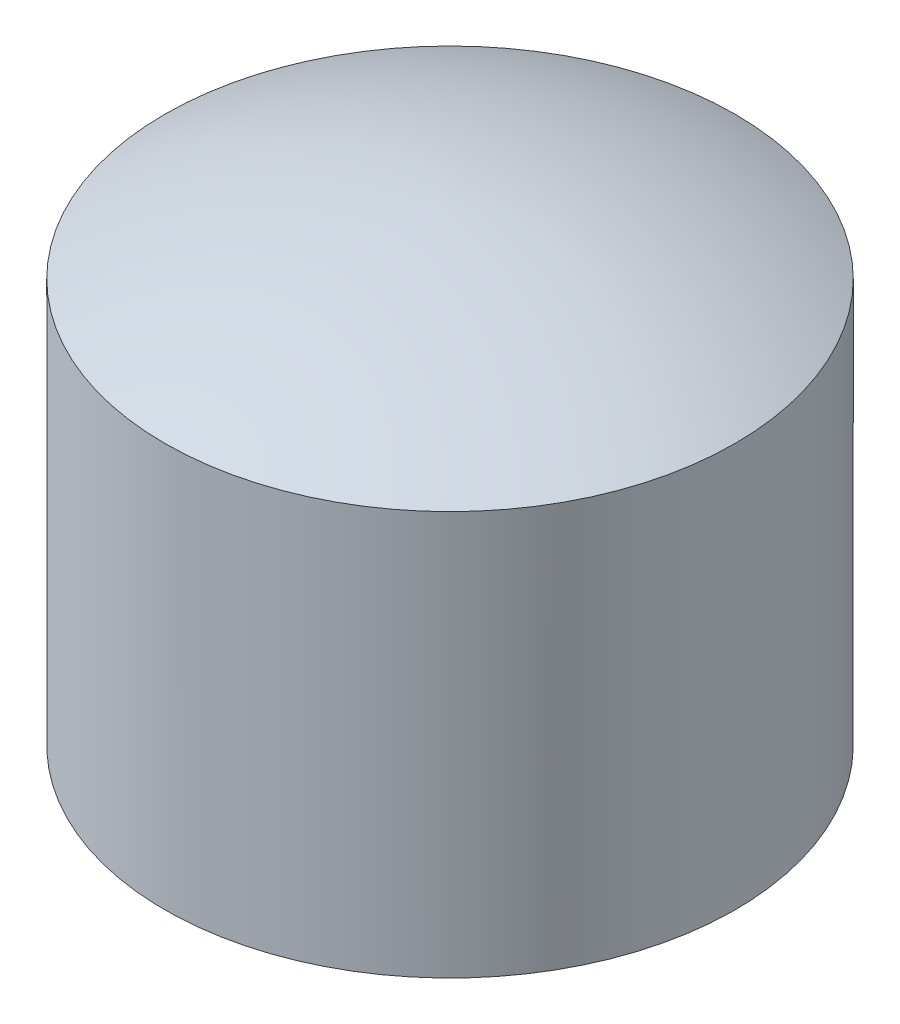
ISO-10303-21;
HEADER;
FILE_DESCRIPTION(('STEP AP214'),'2;1');
FILE_NAME('part.step','',(''),(''),'','','');
FILE_SCHEMA(('AUTOMOTIVE_DESIGN { 1 0 10303 214 1 1 1 1 }'));
ENDSEC;
DATA;
#1=APPLICATION_CONTEXT('core data for automotive mechanical design processes');
#2=APPLICATION_PROTOCOL_DEFINITION('international standard','automotive_design',2000,#1);
#3=PRODUCT_CONTEXT('',#1,'mechanical');
#4=PRODUCT('Part','Part','',(#3));
#5=PRODUCT_RELATED_PRODUCT_CATEGORY('part','',(#4));
#6=PRODUCT_DEFINITION_FORMATION('','',#4);
#7=PRODUCT_DEFINITION_CONTEXT('part definition',#1,'design');
#8=PRODUCT_DEFINITION('design','',#6,#7);
#9=PRODUCT_DEFINITION_SHAPE('','',#8);
#10=(LENGTH_UNIT() NAMED_UNIT(*) SI_UNIT(.MILLI.,.METRE.));
#11=(NAMED_UNIT(*) PLANE_ANGLE_UNIT() SI_UNIT($,.RADIAN.));
#12=(NAMED_UNIT(*) SI_UNIT($,.STERADIAN.) SOLID_ANGLE_UNIT());
#13=UNCERTAINTY_MEASURE_WITH_UNIT(LENGTH_MEASURE(1.E-05),#10,'distance_accuracy_value','');
#14=(GEOMETRIC_REPRESENTATION_CONTEXT(3) GLOBAL_UNCERTAINTY_ASSIGNED_CONTEXT((#13)) GLOBAL_UNIT_ASSIGNED_CONTEXT((#10,
#11,#12)) REPRESENTATION_CONTEXT('',''));
#15=CARTESIAN_POINT('',(0.,0.,0.));
#16=DIRECTION('',(0.,0.,1.));
#17=DIRECTION('',(1.,0.,0.));
#18=AXIS2_PLACEMENT_3D('',#15,#16,#17);
#19=CARTESIAN_POINT('',(0.,4.5,0.));
#20=DIRECTION('',(0.,-1.,0.));
#21=DIRECTION('',(0.,0.,-1.));
#22=AXIS2_PLACEMENT_3D('',#19,#20,#21);
#23=CYLINDRICAL_SURFACE('',#22,6.);
#24=CARTESIAN_POINT('',(0.,4.5,0.));
#25=DIRECTION('',(0.,1.,0.));
#26=DIRECTION('',(0.,0.,1.));
#27=AXIS2_PLACEMENT_3D('',#24,#25,#26);
#28=CIRCLE('',#27,6.);
#29=CARTESIAN_POINT('',(0.,4.5,6.));
#30=VERTEX_POINT('',#29);
#31=EDGE_CURVE('E11',#30,#30,#28,.T.);
#32=ORIENTED_EDGE('',*,*,#31,.F.);
#33=EDGE_LOOP('',(#32));
#34=FACE_BOUND('',#33,.T.);
#35=CARTESIAN_POINT('',(0.,-4.,0.));
#36=DIRECTION('',(0.,-1.,0.));
#37=DIRECTION('',(0.,0.,-1.));
#38=AXIS2_PLACEMENT_3D('',#35,#36,#37);
#39=CIRCLE('',#38,6.);
#40=CARTESIAN_POINT('',(0.,-4.,-6.));
#41=VERTEX_POINT('',#40);
#42=EDGE_CURVE('E59',#41,#41,#39,.T.);
#43=ORIENTED_EDGE('',*,*,#42,.F.);
#44=EDGE_LOOP('',(#43));
#45=FACE_BOUND('',#44,.T.);
#46=ADVANCED_FACE('F39',(#34,#45),#23,.T.);
#47=CARTESIAN_POINT('',(0.,-8.04590227098336,0.337374821797974));
#48=DIRECTION('',(-1.,0.,0.));
#49=DIRECTION('',(0.,0.,-1.));
#50=AXIS2_PLACEMENT_3D('',#47,#48,#49);
#51=CIRCLE('',#50,14.0556744208531);
#52=TRIMMED_CURVE('',#51,(PARAMETER_VALUE(-1.54679127264386)),
(PARAMETER_VALUE(1.54679127264386)),.T.,.PARAMETER.);
#53=CARTESIAN_POINT('',(0.,-8.04590227098336,0.));
#54=DIRECTION('',(0.,-1.,0.));
#55=AXIS1_PLACEMENT('',#53,#54);
#56=SURFACE_OF_REVOLUTION('',#52,#55);
#57=CARTESIAN_POINT('',(0.,6.00572260497462,0.));
#58=VERTEX_POINT('',#57);
#59=VERTEX_LOOP('',#58);
#60=FACE_BOUND('',#59,.T.);
#61=ORIENTED_EDGE('',*,*,#31,.T.);
#62=EDGE_LOOP('',(#61));
#63=FACE_BOUND('',#62,.T.);
#64=ADVANCED_FACE('F48',(#60,#63),#56,.T.);
#65=CARTESIAN_POINT('',(0.,-4.,0.));
#66=DIRECTION('',(0.,-1.,0.));
#67=DIRECTION('',(0.,0.,-1.));
#68=AXIS2_PLACEMENT_3D('',#65,#66,#67);
#69=PLANE('',#68);
#70=ORIENTED_EDGE('',*,*,#42,.T.);
#71=EDGE_LOOP('',(#70));
#72=FACE_BOUND('',#71,.T.);
#73=CARTESIAN_POINT('',(0.,-4.,0.));
#74=DIRECTION('',(0.,-1.,0.));
#75=DIRECTION('',(0.,0.,-1.));
#76=AXIS2_PLACEMENT_3D('',#73,#74,#75);
#77=CIRCLE('',#76,4.);
#78=CARTESIAN_POINT('',(0.,-4.,-4.));
#79=VERTEX_POINT('',#78);
#80=EDGE_CURVE('E61',#79,#79,#77,.T.);
#81=ORIENTED_EDGE('',*,*,#80,.F.);
#82=EDGE_LOOP('',(#81));
#83=FACE_BOUND('',#82,.T.);
#84=ADVANCED_FACE('F51',(#72,#83),#69,.T.);
#85=CARTESIAN_POINT('',(0.,4.5,0.));
#86=DIRECTION('',(0.,-1.,0.));
#87=DIRECTION('',(0.,0.,-1.));
#88=AXIS2_PLACEMENT_3D('',#85,#86,#87);
#89=PLANE('',#88);
#90=CARTESIAN_POINT('',(0.,4.5,0.));
#91=DIRECTION('',(0.,-1.,0.));
#92=DIRECTION('',(0.,0.,-1.));
#93=AXIS2_PLACEMENT_3D('',#90,#91,#92);
#94=CIRCLE('',#93,4.);
#95=CARTESIAN_POINT('',(0.,4.5,-4.));
#96=VERTEX_POINT('',#95);
#97=EDGE_CURVE('E45',#96,#96,#94,.T.);
#98=ORIENTED_EDGE('',*,*,#97,.T.);
#99=EDGE_LOOP('',(#98));
#100=FACE_BOUND('',#99,.T.);
#101=ADVANCED_FACE('F71',(#100),#89,.T.);
#102=CARTESIAN_POINT('',(0.,4.5,0.));
#103=DIRECTION('',(0.,-1.,0.));
#104=DIRECTION('',(0.,0.,-1.));
#105=AXIS2_PLACEMENT_3D('',#102,#103,#104);
#106=CYLINDRICAL_SURFACE('',#105,4.);
#107=ORIENTED_EDGE('',*,*,#97,.F.);
#108=EDGE_LOOP('',(#107));
#109=FACE_BOUND('',#108,.T.);
#110=ORIENTED_EDGE('',*,*,#80,.T.);
#111=EDGE_LOOP('',(#110));
#112=FACE_BOUND('',#111,.T.);
#113=ADVANCED_FACE('F68',(#109,#112),#106,.F.);
#114=CLOSED_SHELL('',(#46,#64,#84,#101,#113));
#115=MANIFOLD_SOLID_BREP('B2',#114);
#116=ADVANCED_BREP_SHAPE_REPRESENTATION('',(#18,#115),#14);
#117=SHAPE_DEFINITION_REPRESENTATION(#9,#116);
ENDSEC;
END-ISO-10303-21;
